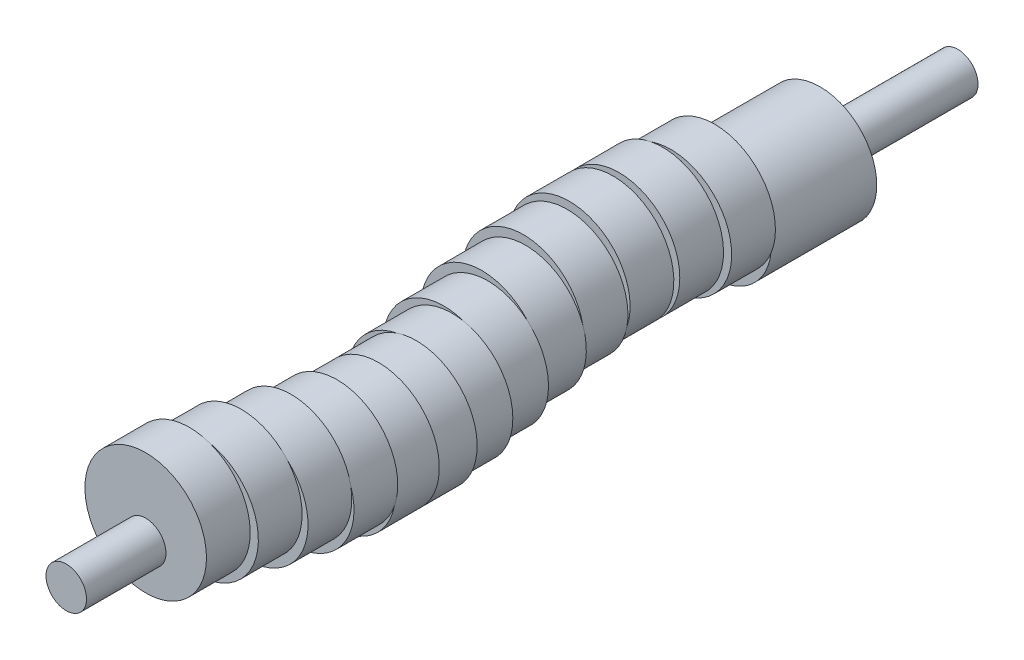
ISO-10303-21;
HEADER;
FILE_DESCRIPTION(('STEP AP214'),'2;1');
FILE_NAME('part.step','',(''),(''),'','','');
FILE_SCHEMA(('AUTOMOTIVE_DESIGN { 1 0 10303 214 1 1 1 1 }'));
ENDSEC;
DATA;
#1=APPLICATION_CONTEXT('core data for automotive mechanical design processes');
#2=APPLICATION_PROTOCOL_DEFINITION('international standard','automotive_design',2000,#1);
#3=PRODUCT_CONTEXT('',#1,'mechanical');
#4=PRODUCT('Part','Part','',(#3));
#5=PRODUCT_RELATED_PRODUCT_CATEGORY('part','',(#4));
#6=PRODUCT_DEFINITION_FORMATION('','',#4);
#7=PRODUCT_DEFINITION_CONTEXT('part definition',#1,'design');
#8=PRODUCT_DEFINITION('design','',#6,#7);
#9=PRODUCT_DEFINITION_SHAPE('','',#8);
#10=(LENGTH_UNIT() NAMED_UNIT(*) SI_UNIT(.MILLI.,.METRE.));
#11=(NAMED_UNIT(*) PLANE_ANGLE_UNIT() SI_UNIT($,.RADIAN.));
#12=(NAMED_UNIT(*) SI_UNIT($,.STERADIAN.) SOLID_ANGLE_UNIT());
#13=UNCERTAINTY_MEASURE_WITH_UNIT(LENGTH_MEASURE(1.E-05),#10,'distance_accuracy_value','');
#14=(GEOMETRIC_REPRESENTATION_CONTEXT(3) GLOBAL_UNCERTAINTY_ASSIGNED_CONTEXT((#13)) GLOBAL_UNIT_ASSIGNED_CONTEXT((#10,
#11,#12)) REPRESENTATION_CONTEXT('',''));
#15=CARTESIAN_POINT('',(0.,0.,0.));
#16=DIRECTION('',(0.,0.,1.));
#17=DIRECTION('',(1.,0.,0.));
#18=AXIS2_PLACEMENT_3D('',#15,#16,#17);
#19=CARTESIAN_POINT('',(0.,2.,5.4));
#20=DIRECTION('',(0.,0.,1.));
#21=DIRECTION('',(1.,0.,0.));
#22=AXIS2_PLACEMENT_3D('',#19,#20,#21);
#23=PLANE('',#22);
#24=CARTESIAN_POINT('',(0.,2.,5.4));
#25=DIRECTION('',(0.,0.,1.));
#26=DIRECTION('',(1.,0.,0.));
#27=AXIS2_PLACEMENT_3D('',#24,#25,#26);
#28=CIRCLE('',#27,7.5);
#29=CARTESIAN_POINT('',(7.5,2.,5.4));
#30=VERTEX_POINT('',#29);
#31=EDGE_CURVE('E278',#30,#30,#28,.T.);
#32=ORIENTED_EDGE('',*,*,#31,.T.);
#33=EDGE_LOOP('',(#32));
#34=FACE_BOUND('',#33,.T.);
#35=CARTESIAN_POINT('',(0.,0.,5.4));
#36=DIRECTION('',(0.,0.,1.));
#37=DIRECTION('',(1.,0.,0.));
#38=AXIS2_PLACEMENT_3D('',#35,#36,#37);
#39=CIRCLE('',#38,2.5);
#40=CARTESIAN_POINT('',(2.5,0.,5.4));
#41=VERTEX_POINT('',#40);
#42=EDGE_CURVE('E268',#41,#41,#39,.T.);
#43=ORIENTED_EDGE('',*,*,#42,.F.);
#44=EDGE_LOOP('',(#43));
#45=FACE_BOUND('',#44,.T.);
#46=ADVANCED_FACE('F39',(#34,#45),#23,.T.);
#47=CARTESIAN_POINT('',(0.,2.,0.));
#48=DIRECTION('',(0.,0.,1.));
#49=DIRECTION('',(1.,0.,0.));
#50=AXIS2_PLACEMENT_3D('',#47,#48,#49);
#51=PLANE('',#50);
#52=CARTESIAN_POINT('',(1.,1.73205080756888,0.));
#53=DIRECTION('',(0.,0.,-1.));
#54=DIRECTION('',(-1.,0.,0.));
#55=AXIS2_PLACEMENT_3D('',#52,#53,#54);
#56=CIRCLE('',#55,7.5);
#57=CARTESIAN_POINT('',(-1.43651396228676,-5.36114309303624,0.));
#58=VERTEX_POINT('',#57);
#59=CARTESIAN_POINT('',(2.43651396228676,9.09319390060512,0.));
#60=VERTEX_POINT('',#59);
#61=EDGE_CURVE('E273',#58,#60,#56,.T.);
#62=ORIENTED_EDGE('',*,*,#61,.F.);
#63=CARTESIAN_POINT('',(0.,2.,0.));
#64=DIRECTION('',(0.,0.,1.));
#65=DIRECTION('',(1.,0.,0.));
#66=AXIS2_PLACEMENT_3D('',#63,#64,#65);
#67=CIRCLE('',#66,7.5);
#68=EDGE_CURVE('E281',#60,#58,#67,.T.);
#69=ORIENTED_EDGE('',*,*,#68,.F.);
#70=EDGE_LOOP('',(#62,#69));
#71=FACE_BOUND('',#70,.T.);
#72=ADVANCED_FACE('F309',(#71),#51,.F.);
#73=CARTESIAN_POINT('',(0.,2.,5.4));
#74=DIRECTION('',(0.,0.,-1.));
#75=DIRECTION('',(-1.,0.,0.));
#76=AXIS2_PLACEMENT_3D('',#73,#74,#75);
#77=CYLINDRICAL_SURFACE('',#76,7.5);
#78=ORIENTED_EDGE('',*,*,#31,.F.);
#79=EDGE_LOOP('',(#78));
#80=FACE_BOUND('',#79,.T.);
#81=ORIENTED_EDGE('',*,*,#68,.T.);
#82=EDGE_CURVE('E277',#58,#60,#67,.T.);
#83=ORIENTED_EDGE('',*,*,#82,.T.);
#84=EDGE_LOOP('',(#81,#83));
#85=FACE_BOUND('',#84,.T.);
#86=ADVANCED_FACE('F41',(#80,#85),#77,.T.);
#87=CARTESIAN_POINT('',(1.,1.73205080756888,-5.4));
#88=DIRECTION('',(0.,0.,-1.));
#89=DIRECTION('',(-1.,0.,0.));
#90=AXIS2_PLACEMENT_3D('',#87,#88,#89);
#91=PLANE('',#90);
#92=CARTESIAN_POINT('',(1.73205080756888,0.999999999999996,-5.4));
#93=DIRECTION('',(0.,0.,-1.));
#94=DIRECTION('',(-1.,0.,0.));
#95=AXIS2_PLACEMENT_3D('',#92,#93,#94);
#96=CIRCLE('',#95,7.5);
#97=CARTESIAN_POINT('',(-3.9246291307495,-3.92462913074948,-5.4));
#98=VERTEX_POINT('',#97);
#99=CARTESIAN_POINT('',(6.65667993831838,6.65667993831836,-5.4));
#100=VERTEX_POINT('',#99);
#101=EDGE_CURVE('E263',#98,#100,#96,.T.);
#102=ORIENTED_EDGE('',*,*,#101,.F.);
#103=CARTESIAN_POINT('',(1.,1.73205080756888,-5.4));
#104=DIRECTION('',(0.,0.,-1.));
#105=DIRECTION('',(-1.,0.,0.));
#106=AXIS2_PLACEMENT_3D('',#103,#104,#105);
#107=CIRCLE('',#106,7.5);
#108=EDGE_CURVE('E269',#98,#100,#107,.T.);
#109=ORIENTED_EDGE('',*,*,#108,.T.);
#110=EDGE_LOOP('',(#102,#109));
#111=FACE_BOUND('',#110,.T.);
#112=ADVANCED_FACE('F297',(#111),#91,.T.);
#113=CARTESIAN_POINT('',(1.,1.73205080756888,0.));
#114=DIRECTION('',(0.,0.,-1.));
#115=DIRECTION('',(-1.,0.,0.));
#116=AXIS2_PLACEMENT_3D('',#113,#114,#115);
#117=PLANE('',#116);
#118=ORIENTED_EDGE('',*,*,#82,.F.);
#119=EDGE_CURVE('E258',#60,#58,#56,.T.);
#120=ORIENTED_EDGE('',*,*,#119,.F.);
#121=EDGE_LOOP('',(#118,#120));
#122=FACE_BOUND('',#121,.T.);
#123=ADVANCED_FACE('F295',(#122),#117,.F.);
#124=CARTESIAN_POINT('',(1.,1.73205080756888,-5.4));
#125=DIRECTION('',(0.,0.,1.));
#126=DIRECTION('',(1.,0.,0.));
#127=AXIS2_PLACEMENT_3D('',#124,#125,#126);
#128=CYLINDRICAL_SURFACE('',#127,7.5);
#129=EDGE_CURVE('E264',#100,#98,#107,.T.);
#130=ORIENTED_EDGE('',*,*,#129,.F.);
#131=ORIENTED_EDGE('',*,*,#108,.F.);
#132=EDGE_LOOP('',(#130,#131));
#133=FACE_BOUND('',#132,.T.);
#134=ORIENTED_EDGE('',*,*,#119,.T.);
#135=ORIENTED_EDGE('',*,*,#61,.T.);
#136=EDGE_LOOP('',(#134,#135));
#137=FACE_BOUND('',#136,.T.);
#138=ADVANCED_FACE('F292',(#133,#137),#128,.T.);
#139=CARTESIAN_POINT('',(1.73205080756888,0.999999999999996,-5.4));
#140=DIRECTION('',(0.,0.,-1.));
#141=DIRECTION('',(-1.,0.,0.));
#142=AXIS2_PLACEMENT_3D('',#139,#140,#141);
#143=PLANE('',#142);
#144=EDGE_CURVE('E248',#100,#98,#96,.T.);
#145=ORIENTED_EDGE('',*,*,#144,.F.);
#146=ORIENTED_EDGE('',*,*,#129,.T.);
#147=EDGE_LOOP('',(#145,#146));
#148=FACE_BOUND('',#147,.T.);
#149=ADVANCED_FACE('F303',(#148),#143,.F.);
#150=CARTESIAN_POINT('',(1.73205080756888,0.999999999999996,-10.8));
#151=DIRECTION('',(0.,0.,-1.));
#152=DIRECTION('',(-1.,0.,0.));
#153=AXIS2_PLACEMENT_3D('',#150,#151,#152);
#154=PLANE('',#153);
#155=CARTESIAN_POINT('',(2.,0.,-10.8));
#156=DIRECTION('',(0.,0.,-1.));
#157=DIRECTION('',(-1.,0.,0.));
#158=AXIS2_PLACEMENT_3D('',#155,#156,#157);
#159=CIRCLE('',#158,7.5);
#160=CARTESIAN_POINT('',(-5.36114309303625,-1.43651396228673,-10.8));
#161=VERTEX_POINT('',#160);
#162=CARTESIAN_POINT('',(9.09319390060513,2.43651396228672,-10.8));
#163=VERTEX_POINT('',#162);
#164=EDGE_CURVE('E253',#161,#163,#159,.T.);
#165=ORIENTED_EDGE('',*,*,#164,.F.);
#166=CARTESIAN_POINT('',(1.73205080756888,0.999999999999996,-10.8));
#167=DIRECTION('',(0.,0.,-1.));
#168=DIRECTION('',(-1.,0.,0.));
#169=AXIS2_PLACEMENT_3D('',#166,#167,#168);
#170=CIRCLE('',#169,7.5);
#171=EDGE_CURVE('E259',#161,#163,#170,.T.);
#172=ORIENTED_EDGE('',*,*,#171,.T.);
#173=EDGE_LOOP('',(#165,#172));
#174=FACE_BOUND('',#173,.T.);
#175=ADVANCED_FACE('F454',(#174),#154,.T.);
#176=CARTESIAN_POINT('',(1.73205080756888,0.999999999999996,-10.8));
#177=DIRECTION('',(0.,0.,1.));
#178=DIRECTION('',(1.,0.,0.));
#179=AXIS2_PLACEMENT_3D('',#176,#177,#178);
#180=CYLINDRICAL_SURFACE('',#179,7.5);
#181=EDGE_CURVE('E254',#163,#161,#170,.T.);
#182=ORIENTED_EDGE('',*,*,#181,.F.);
#183=ORIENTED_EDGE('',*,*,#171,.F.);
#184=EDGE_LOOP('',(#182,#183));
#185=FACE_BOUND('',#184,.T.);
#186=ORIENTED_EDGE('',*,*,#144,.T.);
#187=ORIENTED_EDGE('',*,*,#101,.T.);
#188=EDGE_LOOP('',(#186,#187));
#189=FACE_BOUND('',#188,.T.);
#190=ADVANCED_FACE('F449',(#185,#189),#180,.T.);
#191=CARTESIAN_POINT('',(2.,0.,-10.8));
#192=DIRECTION('',(0.,0.,-1.));
#193=DIRECTION('',(-1.,0.,0.));
#194=AXIS2_PLACEMENT_3D('',#191,#192,#193);
#195=PLANE('',#194);
#196=EDGE_CURVE('E239',#163,#161,#159,.T.);
#197=ORIENTED_EDGE('',*,*,#196,.F.);
#198=ORIENTED_EDGE('',*,*,#181,.T.);
#199=EDGE_LOOP('',(#197,#198));
#200=FACE_BOUND('',#199,.T.);
#201=ADVANCED_FACE('F445',(#200),#195,.F.);
#202=CARTESIAN_POINT('',(2.,0.,-16.2));
#203=DIRECTION('',(0.,0.,-1.));
#204=DIRECTION('',(-1.,0.,0.));
#205=AXIS2_PLACEMENT_3D('',#202,#203,#204);
#206=PLANE('',#205);
#207=CARTESIAN_POINT('',(1.73205080756888,-1.,-16.2));
#208=DIRECTION('',(0.,0.,-1.));
#209=DIRECTION('',(-1.,0.,0.));
#210=AXIS2_PLACEMENT_3D('',#207,#208,#209);
#211=CIRCLE('',#210,7.5);
#212=CARTESIAN_POINT('',(-5.36114309303624,1.43651396228677,-16.2));
#213=VERTEX_POINT('',#212);
#214=CARTESIAN_POINT('',(9.09319390060512,-2.43651396228678,-16.2));
#215=VERTEX_POINT('',#214);
#216=EDGE_CURVE('E241',#213,#215,#211,.T.);
#217=ORIENTED_EDGE('',*,*,#216,.F.);
#218=CARTESIAN_POINT('',(2.,0.,-16.2));
#219=DIRECTION('',(0.,0.,-1.));
#220=DIRECTION('',(-1.,0.,0.));
#221=AXIS2_PLACEMENT_3D('',#218,#219,#220);
#222=CIRCLE('',#221,7.5);
#223=EDGE_CURVE('E245',#213,#215,#222,.T.);
#224=ORIENTED_EDGE('',*,*,#223,.T.);
#225=EDGE_LOOP('',(#217,#224));
#226=FACE_BOUND('',#225,.T.);
#227=ADVANCED_FACE('F442',(#226),#206,.T.);
#228=CARTESIAN_POINT('',(2.,0.,-16.2));
#229=DIRECTION('',(0.,0.,1.));
#230=DIRECTION('',(1.,0.,0.));
#231=AXIS2_PLACEMENT_3D('',#228,#229,#230);
#232=CYLINDRICAL_SURFACE('',#231,7.5);
#233=ORIENTED_EDGE('',*,*,#223,.F.);
#234=EDGE_CURVE('E249',#215,#213,#222,.T.);
#235=ORIENTED_EDGE('',*,*,#234,.F.);
#236=EDGE_LOOP('',(#233,#235));
#237=FACE_BOUND('',#236,.T.);
#238=ORIENTED_EDGE('',*,*,#196,.T.);
#239=ORIENTED_EDGE('',*,*,#164,.T.);
#240=EDGE_LOOP('',(#238,#239));
#241=FACE_BOUND('',#240,.T.);
#242=ADVANCED_FACE('F437',(#237,#241),#232,.T.);
#243=CARTESIAN_POINT('',(1.73205080756888,-1.,-16.2));
#244=DIRECTION('',(0.,0.,-1.));
#245=DIRECTION('',(-1.,0.,0.));
#246=AXIS2_PLACEMENT_3D('',#243,#244,#245);
#247=PLANE('',#246);
#248=EDGE_CURVE('E230',#215,#213,#211,.T.);
#249=ORIENTED_EDGE('',*,*,#248,.F.);
#250=ORIENTED_EDGE('',*,*,#234,.T.);
#251=EDGE_LOOP('',(#249,#250));
#252=FACE_BOUND('',#251,.T.);
#253=ADVANCED_FACE('F433',(#252),#247,.F.);
#254=CARTESIAN_POINT('',(1.73205080756888,-1.,-21.6));
#255=DIRECTION('',(0.,0.,-1.));
#256=DIRECTION('',(-1.,0.,0.));
#257=AXIS2_PLACEMENT_3D('',#254,#255,#256);
#258=PLANE('',#257);
#259=CARTESIAN_POINT('',(0.999999999999995,-1.73205080756888,-21.6));
#260=DIRECTION('',(0.,0.,-1.));
#261=DIRECTION('',(-1.,0.,0.));
#262=AXIS2_PLACEMENT_3D('',#259,#260,#261);
#263=CIRCLE('',#262,7.5);
#264=CARTESIAN_POINT('',(-3.92462913074948,3.9246291307495,-21.6));
#265=VERTEX_POINT('',#264);
#266=CARTESIAN_POINT('',(6.65667993831836,-6.65667993831838,-21.6));
#267=VERTEX_POINT('',#266);
#268=EDGE_CURVE('E232',#265,#267,#263,.T.);
#269=ORIENTED_EDGE('',*,*,#268,.F.);
#270=CARTESIAN_POINT('',(1.73205080756888,-1.,-21.6));
#271=DIRECTION('',(0.,0.,-1.));
#272=DIRECTION('',(-1.,0.,0.));
#273=AXIS2_PLACEMENT_3D('',#270,#271,#272);
#274=CIRCLE('',#273,7.5);
#275=EDGE_CURVE('E236',#265,#267,#274,.T.);
#276=ORIENTED_EDGE('',*,*,#275,.T.);
#277=EDGE_LOOP('',(#269,#276));
#278=FACE_BOUND('',#277,.T.);
#279=ADVANCED_FACE('F430',(#278),#258,.T.);
#280=CARTESIAN_POINT('',(1.73205080756888,-1.,-21.6));
#281=DIRECTION('',(0.,0.,1.));
#282=DIRECTION('',(1.,0.,0.));
#283=AXIS2_PLACEMENT_3D('',#280,#281,#282);
#284=CYLINDRICAL_SURFACE('',#283,7.5);
#285=ORIENTED_EDGE('',*,*,#275,.F.);
#286=EDGE_CURVE('E240',#267,#265,#274,.T.);
#287=ORIENTED_EDGE('',*,*,#286,.F.);
#288=EDGE_LOOP('',(#285,#287));
#289=FACE_BOUND('',#288,.T.);
#290=ORIENTED_EDGE('',*,*,#216,.T.);
#291=ORIENTED_EDGE('',*,*,#248,.T.);
#292=EDGE_LOOP('',(#290,#291));
#293=FACE_BOUND('',#292,.T.);
#294=ADVANCED_FACE('F425',(#289,#293),#284,.T.);
#295=CARTESIAN_POINT('',(0.999999999999995,-1.73205080756888,-21.6));
#296=DIRECTION('',(0.,0.,-1.));
#297=DIRECTION('',(-1.,0.,0.));
#298=AXIS2_PLACEMENT_3D('',#295,#296,#297);
#299=PLANE('',#298);
#300=EDGE_CURVE('E221',#267,#265,#263,.T.);
#301=ORIENTED_EDGE('',*,*,#300,.F.);
#302=ORIENTED_EDGE('',*,*,#286,.T.);
#303=EDGE_LOOP('',(#301,#302));
#304=FACE_BOUND('',#303,.T.);
#305=ADVANCED_FACE('F421',(#304),#299,.F.);
#306=CARTESIAN_POINT('',(0.999999999999995,-1.73205080756888,-27.));
#307=DIRECTION('',(0.,0.,-1.));
#308=DIRECTION('',(-1.,0.,0.));
#309=AXIS2_PLACEMENT_3D('',#306,#307,#308);
#310=PLANE('',#309);
#311=CARTESIAN_POINT('',(0.,-2.,-27.));
#312=DIRECTION('',(0.,0.,-1.));
#313=DIRECTION('',(-1.,0.,0.));
#314=AXIS2_PLACEMENT_3D('',#311,#312,#313);
#315=CIRCLE('',#314,7.5);
#316=CARTESIAN_POINT('',(-1.43651396228675,5.36114309303624,-27.));
#317=VERTEX_POINT('',#316);
#318=CARTESIAN_POINT('',(2.43651396228673,-9.09319390060513,-27.));
#319=VERTEX_POINT('',#318);
#320=EDGE_CURVE('E223',#317,#319,#315,.T.);
#321=ORIENTED_EDGE('',*,*,#320,.F.);
#322=CARTESIAN_POINT('',(0.999999999999995,-1.73205080756888,-27.));
#323=DIRECTION('',(0.,0.,-1.));
#324=DIRECTION('',(-1.,0.,0.));
#325=AXIS2_PLACEMENT_3D('',#322,#323,#324);
#326=CIRCLE('',#325,7.5);
#327=EDGE_CURVE('E227',#317,#319,#326,.T.);
#328=ORIENTED_EDGE('',*,*,#327,.T.);
#329=EDGE_LOOP('',(#321,#328));
#330=FACE_BOUND('',#329,.T.);
#331=ADVANCED_FACE('F418',(#330),#310,.T.);
#332=CARTESIAN_POINT('',(0.999999999999995,-1.73205080756888,-27.));
#333=DIRECTION('',(0.,0.,1.));
#334=DIRECTION('',(1.,0.,0.));
#335=AXIS2_PLACEMENT_3D('',#332,#333,#334);
#336=CYLINDRICAL_SURFACE('',#335,7.5);
#337=ORIENTED_EDGE('',*,*,#327,.F.);
#338=EDGE_CURVE('E231',#319,#317,#326,.T.);
#339=ORIENTED_EDGE('',*,*,#338,.F.);
#340=EDGE_LOOP('',(#337,#339));
#341=FACE_BOUND('',#340,.T.);
#342=ORIENTED_EDGE('',*,*,#268,.T.);
#343=ORIENTED_EDGE('',*,*,#300,.T.);
#344=EDGE_LOOP('',(#342,#343));
#345=FACE_BOUND('',#344,.T.);
#346=ADVANCED_FACE('F413',(#341,#345),#336,.T.);
#347=CARTESIAN_POINT('',(0.,-2.,-27.));
#348=DIRECTION('',(0.,0.,-1.));
#349=DIRECTION('',(-1.,0.,0.));
#350=AXIS2_PLACEMENT_3D('',#347,#348,#349);
#351=PLANE('',#350);
#352=EDGE_CURVE('E212',#319,#317,#315,.T.);
#353=ORIENTED_EDGE('',*,*,#352,.F.);
#354=ORIENTED_EDGE('',*,*,#338,.T.);
#355=EDGE_LOOP('',(#353,#354));
#356=FACE_BOUND('',#355,.T.);
#357=ADVANCED_FACE('F409',(#356),#351,.F.);
#358=CARTESIAN_POINT('',(0.,-2.,-32.4));
#359=DIRECTION('',(0.,0.,-1.));
#360=DIRECTION('',(-1.,0.,0.));
#361=AXIS2_PLACEMENT_3D('',#358,#359,#360);
#362=PLANE('',#361);
#363=CARTESIAN_POINT('',(-0.99999999999999,-1.73205080756888,-32.4));
#364=DIRECTION('',(0.,0.,-1.));
#365=DIRECTION('',(-1.,0.,0.));
#366=AXIS2_PLACEMENT_3D('',#363,#364,#365);
#367=CIRCLE('',#366,7.5);
#368=CARTESIAN_POINT('',(1.43651396228675,5.36114309303624,-32.4));
#369=VERTEX_POINT('',#368);
#370=CARTESIAN_POINT('',(-2.43651396228672,-9.09319390060513,-32.4));
#371=VERTEX_POINT('',#370);
#372=EDGE_CURVE('E214',#369,#371,#367,.T.);
#373=ORIENTED_EDGE('',*,*,#372,.F.);
#374=CARTESIAN_POINT('',(0.,-2.,-32.4));
#375=DIRECTION('',(0.,0.,-1.));
#376=DIRECTION('',(-1.,0.,0.));
#377=AXIS2_PLACEMENT_3D('',#374,#375,#376);
#378=CIRCLE('',#377,7.5);
#379=EDGE_CURVE('E218',#369,#371,#378,.T.);
#380=ORIENTED_EDGE('',*,*,#379,.T.);
#381=EDGE_LOOP('',(#373,#380));
#382=FACE_BOUND('',#381,.T.);
#383=ADVANCED_FACE('F406',(#382),#362,.T.);
#384=CARTESIAN_POINT('',(0.,-2.,-32.4));
#385=DIRECTION('',(0.,0.,1.));
#386=DIRECTION('',(1.,0.,0.));
#387=AXIS2_PLACEMENT_3D('',#384,#385,#386);
#388=CYLINDRICAL_SURFACE('',#387,7.5);
#389=ORIENTED_EDGE('',*,*,#379,.F.);
#390=EDGE_CURVE('E222',#371,#369,#378,.T.);
#391=ORIENTED_EDGE('',*,*,#390,.F.);
#392=EDGE_LOOP('',(#389,#391));
#393=FACE_BOUND('',#392,.T.);
#394=ORIENTED_EDGE('',*,*,#320,.T.);
#395=ORIENTED_EDGE('',*,*,#352,.T.);
#396=EDGE_LOOP('',(#394,#395));
#397=FACE_BOUND('',#396,.T.);
#398=ADVANCED_FACE('F401',(#393,#397),#388,.T.);
#399=CARTESIAN_POINT('',(-0.99999999999999,-1.73205080756888,-32.4));
#400=DIRECTION('',(0.,0.,-1.));
#401=DIRECTION('',(-1.,0.,0.));
#402=AXIS2_PLACEMENT_3D('',#399,#400,#401);
#403=PLANE('',#402);
#404=EDGE_CURVE('E203',#371,#369,#367,.T.);
#405=ORIENTED_EDGE('',*,*,#404,.F.);
#406=ORIENTED_EDGE('',*,*,#390,.T.);
#407=EDGE_LOOP('',(#405,#406));
#408=FACE_BOUND('',#407,.T.);
#409=ADVANCED_FACE('F397',(#408),#403,.F.);
#410=CARTESIAN_POINT('',(-0.99999999999999,-1.73205080756888,-37.8));
#411=DIRECTION('',(0.,0.,-1.));
#412=DIRECTION('',(-1.,0.,0.));
#413=AXIS2_PLACEMENT_3D('',#410,#411,#412);
#414=PLANE('',#413);
#415=CARTESIAN_POINT('',(-1.73205080756887,-1.00000000000001,-37.8));
#416=DIRECTION('',(0.,0.,-1.));
#417=DIRECTION('',(-1.,0.,0.));
#418=AXIS2_PLACEMENT_3D('',#415,#416,#417);
#419=CIRCLE('',#418,7.5);
#420=CARTESIAN_POINT('',(3.92462913074947,3.92462913074952,-37.8));
#421=VERTEX_POINT('',#420);
#422=CARTESIAN_POINT('',(-6.65667993831833,-6.65667993831841,-37.8));
#423=VERTEX_POINT('',#422);
#424=EDGE_CURVE('E205',#421,#423,#419,.T.);
#425=ORIENTED_EDGE('',*,*,#424,.F.);
#426=CARTESIAN_POINT('',(-0.99999999999999,-1.73205080756888,-37.8));
#427=DIRECTION('',(0.,0.,-1.));
#428=DIRECTION('',(-1.,0.,0.));
#429=AXIS2_PLACEMENT_3D('',#426,#427,#428);
#430=CIRCLE('',#429,7.5);
#431=EDGE_CURVE('E209',#421,#423,#430,.T.);
#432=ORIENTED_EDGE('',*,*,#431,.T.);
#433=EDGE_LOOP('',(#425,#432));
#434=FACE_BOUND('',#433,.T.);
#435=ADVANCED_FACE('F394',(#434),#414,.T.);
#436=CARTESIAN_POINT('',(-0.99999999999999,-1.73205080756888,-37.8));
#437=DIRECTION('',(0.,0.,1.));
#438=DIRECTION('',(1.,0.,0.));
#439=AXIS2_PLACEMENT_3D('',#436,#437,#438);
#440=CYLINDRICAL_SURFACE('',#439,7.5);
#441=ORIENTED_EDGE('',*,*,#431,.F.);
#442=EDGE_CURVE('E213',#423,#421,#430,.T.);
#443=ORIENTED_EDGE('',*,*,#442,.F.);
#444=EDGE_LOOP('',(#441,#443));
#445=FACE_BOUND('',#444,.T.);
#446=ORIENTED_EDGE('',*,*,#372,.T.);
#447=ORIENTED_EDGE('',*,*,#404,.T.);
#448=EDGE_LOOP('',(#446,#447));
#449=FACE_BOUND('',#448,.T.);
#450=ADVANCED_FACE('F389',(#445,#449),#440,.T.);
#451=CARTESIAN_POINT('',(-1.73205080756887,-1.00000000000001,-37.8));
#452=DIRECTION('',(0.,0.,-1.));
#453=DIRECTION('',(-1.,0.,0.));
#454=AXIS2_PLACEMENT_3D('',#451,#452,#453);
#455=PLANE('',#454);
#456=EDGE_CURVE('E194',#423,#421,#419,.T.);
#457=ORIENTED_EDGE('',*,*,#456,.F.);
#458=ORIENTED_EDGE('',*,*,#442,.T.);
#459=EDGE_LOOP('',(#457,#458));
#460=FACE_BOUND('',#459,.T.);
#461=ADVANCED_FACE('F385',(#460),#455,.F.);
#462=CARTESIAN_POINT('',(-1.73205080756887,-1.00000000000001,-43.2));
#463=DIRECTION('',(0.,0.,-1.));
#464=DIRECTION('',(-1.,0.,0.));
#465=AXIS2_PLACEMENT_3D('',#462,#463,#464);
#466=PLANE('',#465);
#467=CARTESIAN_POINT('',(-2.,0.,-43.2));
#468=DIRECTION('',(0.,0.,-1.));
#469=DIRECTION('',(-1.,0.,0.));
#470=AXIS2_PLACEMENT_3D('',#467,#468,#469);
#471=CIRCLE('',#470,7.5);
#472=CARTESIAN_POINT('',(5.36114309303624,1.43651396228677,-43.2));
#473=VERTEX_POINT('',#472);
#474=CARTESIAN_POINT('',(-9.09319390060512,-2.43651396228677,-43.2));
#475=VERTEX_POINT('',#474);
#476=EDGE_CURVE('E196',#473,#475,#471,.T.);
#477=ORIENTED_EDGE('',*,*,#476,.F.);
#478=CARTESIAN_POINT('',(-1.73205080756887,-1.00000000000001,-43.2));
#479=DIRECTION('',(0.,0.,-1.));
#480=DIRECTION('',(-1.,0.,0.));
#481=AXIS2_PLACEMENT_3D('',#478,#479,#480);
#482=CIRCLE('',#481,7.5);
#483=EDGE_CURVE('E200',#473,#475,#482,.T.);
#484=ORIENTED_EDGE('',*,*,#483,.T.);
#485=EDGE_LOOP('',(#477,#484));
#486=FACE_BOUND('',#485,.T.);
#487=ADVANCED_FACE('F382',(#486),#466,.T.);
#488=CARTESIAN_POINT('',(-1.73205080756887,-1.00000000000001,-43.2));
#489=DIRECTION('',(0.,0.,1.));
#490=DIRECTION('',(1.,0.,0.));
#491=AXIS2_PLACEMENT_3D('',#488,#489,#490);
#492=CYLINDRICAL_SURFACE('',#491,7.5);
#493=ORIENTED_EDGE('',*,*,#483,.F.);
#494=EDGE_CURVE('E204',#475,#473,#482,.T.);
#495=ORIENTED_EDGE('',*,*,#494,.F.);
#496=EDGE_LOOP('',(#493,#495));
#497=FACE_BOUND('',#496,.T.);
#498=ORIENTED_EDGE('',*,*,#424,.T.);
#499=ORIENTED_EDGE('',*,*,#456,.T.);
#500=EDGE_LOOP('',(#498,#499));
#501=FACE_BOUND('',#500,.T.);
#502=ADVANCED_FACE('F377',(#497,#501),#492,.T.);
#503=CARTESIAN_POINT('',(-2.,0.,-43.2));
#504=DIRECTION('',(0.,0.,-1.));
#505=DIRECTION('',(-1.,0.,0.));
#506=AXIS2_PLACEMENT_3D('',#503,#504,#505);
#507=PLANE('',#506);
#508=EDGE_CURVE('E184',#475,#473,#471,.T.);
#509=ORIENTED_EDGE('',*,*,#508,.F.);
#510=ORIENTED_EDGE('',*,*,#494,.T.);
#511=EDGE_LOOP('',(#509,#510));
#512=FACE_BOUND('',#511,.T.);
#513=ADVANCED_FACE('F373',(#512),#507,.F.);
#514=CARTESIAN_POINT('',(-2.,0.,-48.6));
#515=DIRECTION('',(0.,0.,-1.));
#516=DIRECTION('',(-1.,0.,0.));
#517=AXIS2_PLACEMENT_3D('',#514,#515,#516);
#518=PLANE('',#517);
#519=CARTESIAN_POINT('',(-1.73205080756888,0.99999999999999,-48.6));
#520=DIRECTION('',(0.,0.,-1.));
#521=DIRECTION('',(-1.,0.,0.));
#522=AXIS2_PLACEMENT_3D('',#519,#520,#521);
#523=CIRCLE('',#522,7.5);
#524=CARTESIAN_POINT('',(5.36114309303625,-1.43651396228673,-48.6));
#525=VERTEX_POINT('',#524);
#526=CARTESIAN_POINT('',(-9.09319390060513,2.43651396228674,-48.6));
#527=VERTEX_POINT('',#526);
#528=EDGE_CURVE('E189',#525,#527,#523,.T.);
#529=ORIENTED_EDGE('',*,*,#528,.F.);
#530=CARTESIAN_POINT('',(-2.,0.,-48.6));
#531=DIRECTION('',(0.,0.,-1.));
#532=DIRECTION('',(-1.,0.,0.));
#533=AXIS2_PLACEMENT_3D('',#530,#531,#532);
#534=CIRCLE('',#533,7.5);
#535=EDGE_CURVE('E195',#525,#527,#534,.T.);
#536=ORIENTED_EDGE('',*,*,#535,.T.);
#537=EDGE_LOOP('',(#529,#536));
#538=FACE_BOUND('',#537,.T.);
#539=ADVANCED_FACE('F370',(#538),#518,.T.);
#540=CARTESIAN_POINT('',(-2.,0.,-48.6));
#541=DIRECTION('',(0.,0.,1.));
#542=DIRECTION('',(1.,0.,0.));
#543=AXIS2_PLACEMENT_3D('',#540,#541,#542);
#544=CYLINDRICAL_SURFACE('',#543,7.5);
#545=EDGE_CURVE('E190',#527,#525,#534,.T.);
#546=ORIENTED_EDGE('',*,*,#545,.F.);
#547=ORIENTED_EDGE('',*,*,#535,.F.);
#548=EDGE_LOOP('',(#546,#547));
#549=FACE_BOUND('',#548,.T.);
#550=ORIENTED_EDGE('',*,*,#476,.T.);
#551=ORIENTED_EDGE('',*,*,#508,.T.);
#552=EDGE_LOOP('',(#550,#551));
#553=FACE_BOUND('',#552,.T.);
#554=ADVANCED_FACE('F365',(#549,#553),#544,.T.);
#555=CARTESIAN_POINT('',(-1.73205080756888,0.99999999999999,-48.6));
#556=DIRECTION('',(0.,0.,-1.));
#557=DIRECTION('',(-1.,0.,0.));
#558=AXIS2_PLACEMENT_3D('',#555,#556,#557);
#559=PLANE('',#558);
#560=EDGE_CURVE('E175',#527,#525,#523,.T.);
#561=ORIENTED_EDGE('',*,*,#560,.F.);
#562=ORIENTED_EDGE('',*,*,#545,.T.);
#563=EDGE_LOOP('',(#561,#562));
#564=FACE_BOUND('',#563,.T.);
#565=ADVANCED_FACE('F361',(#564),#559,.F.);
#566=CARTESIAN_POINT('',(-1.73205080756888,0.99999999999999,-54.));
#567=DIRECTION('',(0.,0.,-1.));
#568=DIRECTION('',(-1.,0.,0.));
#569=AXIS2_PLACEMENT_3D('',#566,#567,#568);
#570=PLANE('',#569);
#571=CARTESIAN_POINT('',(-1.00000000000001,1.73205080756887,-54.));
#572=DIRECTION('',(0.,0.,-1.));
#573=DIRECTION('',(-1.,0.,0.));
#574=AXIS2_PLACEMENT_3D('',#571,#572,#573);
#575=CIRCLE('',#574,7.5);
#576=CARTESIAN_POINT('',(3.92462913074951,-3.92462913074948,-54.));
#577=VERTEX_POINT('',#576);
#578=CARTESIAN_POINT('',(-6.65667993831841,6.65667993831833,-54.));
#579=VERTEX_POINT('',#578);
#580=EDGE_CURVE('E49',#577,#579,#575,.T.);
#581=ORIENTED_EDGE('',*,*,#580,.F.);
#582=CARTESIAN_POINT('',(-1.73205080756888,0.99999999999999,-54.));
#583=DIRECTION('',(0.,0.,-1.));
#584=DIRECTION('',(-1.,0.,0.));
#585=AXIS2_PLACEMENT_3D('',#582,#583,#584);
#586=CIRCLE('',#585,7.5);
#587=EDGE_CURVE('E185',#577,#579,#586,.T.);
#588=ORIENTED_EDGE('',*,*,#587,.T.);
#589=EDGE_LOOP('',(#581,#588));
#590=FACE_BOUND('',#589,.T.);
#591=ADVANCED_FACE('F358',(#590),#570,.T.);
#592=CARTESIAN_POINT('',(-1.73205080756888,0.99999999999999,-54.));
#593=DIRECTION('',(0.,0.,1.));
#594=DIRECTION('',(1.,0.,0.));
#595=AXIS2_PLACEMENT_3D('',#592,#593,#594);
#596=CYLINDRICAL_SURFACE('',#595,7.5);
#597=EDGE_CURVE('E180',#579,#577,#586,.T.);
#598=ORIENTED_EDGE('',*,*,#597,.F.);
#599=ORIENTED_EDGE('',*,*,#587,.F.);
#600=EDGE_LOOP('',(#598,#599));
#601=FACE_BOUND('',#600,.T.);
#602=ORIENTED_EDGE('',*,*,#560,.T.);
#603=ORIENTED_EDGE('',*,*,#528,.T.);
#604=EDGE_LOOP('',(#602,#603));
#605=FACE_BOUND('',#604,.T.);
#606=ADVANCED_FACE('F353',(#601,#605),#596,.T.);
#607=CARTESIAN_POINT('',(-1.00000000000001,1.73205080756887,-54.));
#608=DIRECTION('',(0.,0.,-1.));
#609=DIRECTION('',(-1.,0.,0.));
#610=AXIS2_PLACEMENT_3D('',#607,#608,#609);
#611=PLANE('',#610);
#612=EDGE_CURVE('E153',#579,#577,#575,.T.);
#613=ORIENTED_EDGE('',*,*,#612,.F.);
#614=ORIENTED_EDGE('',*,*,#597,.T.);
#615=EDGE_LOOP('',(#613,#614));
#616=FACE_BOUND('',#615,.T.);
#617=ADVANCED_FACE('F350',(#616),#611,.F.);
#618=CARTESIAN_POINT('',(-1.00000000000001,1.73205080756887,-59.4));
#619=DIRECTION('',(0.,0.,-1.));
#620=DIRECTION('',(-1.,0.,0.));
#621=AXIS2_PLACEMENT_3D('',#618,#619,#620);
#622=PLANE('',#621);
#623=CARTESIAN_POINT('',(0.,2.,-59.4));
#624=DIRECTION('',(0.,0.,-1.));
#625=DIRECTION('',(-1.,0.,0.));
#626=AXIS2_PLACEMENT_3D('',#623,#624,#625);
#627=CIRCLE('',#626,7.5);
#628=CARTESIAN_POINT('',(1.43651396228677,-5.36114309303624,-59.4));
#629=VERTEX_POINT('',#628);
#630=CARTESIAN_POINT('',(-2.43651396228677,9.09319390060511,-59.4));
#631=VERTEX_POINT('',#630);
#632=EDGE_CURVE('E11',#629,#631,#627,.T.);
#633=ORIENTED_EDGE('',*,*,#632,.F.);
#634=CARTESIAN_POINT('',(-1.00000000000001,1.73205080756887,-59.4));
#635=DIRECTION('',(0.,0.,-1.));
#636=DIRECTION('',(-1.,0.,0.));
#637=AXIS2_PLACEMENT_3D('',#634,#635,#636);
#638=CIRCLE('',#637,7.5);
#639=EDGE_CURVE('E176',#629,#631,#638,.T.);
#640=ORIENTED_EDGE('',*,*,#639,.T.);
#641=EDGE_LOOP('',(#633,#640));
#642=FACE_BOUND('',#641,.T.);
#643=ADVANCED_FACE('F347',(#642),#622,.T.);
#644=CARTESIAN_POINT('',(-1.00000000000001,1.73205080756887,-59.4));
#645=DIRECTION('',(0.,0.,1.));
#646=DIRECTION('',(1.,0.,0.));
#647=AXIS2_PLACEMENT_3D('',#644,#645,#646);
#648=CYLINDRICAL_SURFACE('',#647,7.5);
#649=EDGE_CURVE('E171',#631,#629,#638,.T.);
#650=ORIENTED_EDGE('',*,*,#649,.F.);
#651=ORIENTED_EDGE('',*,*,#639,.F.);
#652=EDGE_LOOP('',(#650,#651));
#653=FACE_BOUND('',#652,.T.);
#654=ORIENTED_EDGE('',*,*,#612,.T.);
#655=ORIENTED_EDGE('',*,*,#580,.T.);
#656=EDGE_LOOP('',(#654,#655));
#657=FACE_BOUND('',#656,.T.);
#658=ADVANCED_FACE('F343',(#653,#657),#648,.T.);
#659=CARTESIAN_POINT('',(0.,2.,-59.4));
#660=DIRECTION('',(0.,0.,-1.));
#661=DIRECTION('',(-1.,0.,0.));
#662=AXIS2_PLACEMENT_3D('',#659,#660,#661);
#663=PLANE('',#662);
#664=EDGE_CURVE('E51',#631,#629,#627,.T.);
#665=ORIENTED_EDGE('',*,*,#664,.F.);
#666=ORIENTED_EDGE('',*,*,#649,.T.);
#667=EDGE_LOOP('',(#665,#666));
#668=FACE_BOUND('',#667,.T.);
#669=ADVANCED_FACE('F340',(#668),#663,.F.);
#670=CARTESIAN_POINT('',(0.,2.,-64.8));
#671=DIRECTION('',(0.,0.,-1.));
#672=DIRECTION('',(-1.,0.,0.));
#673=AXIS2_PLACEMENT_3D('',#670,#671,#672);
#674=PLANE('',#673);
#675=CARTESIAN_POINT('',(0.,2.,-64.8));
#676=DIRECTION('',(0.,0.,-1.));
#677=DIRECTION('',(-1.,0.,0.));
#678=AXIS2_PLACEMENT_3D('',#675,#676,#677);
#679=CIRCLE('',#678,7.5);
#680=CARTESIAN_POINT('',(-6.95268608165219,-0.812499999999998,-64.8));
#681=VERTEX_POINT('',#680);
#682=CARTESIAN_POINT('',(6.95268608165218,-0.812499999999998,-64.8));
#683=VERTEX_POINT('',#682);
#684=EDGE_CURVE('E57',#681,#683,#679,.T.);
#685=ORIENTED_EDGE('',*,*,#684,.T.);
#686=CARTESIAN_POINT('',(0.,0.,-64.8));
#687=DIRECTION('',(0.,0.,-1.));
#688=DIRECTION('',(-1.,0.,0.));
#689=AXIS2_PLACEMENT_3D('',#686,#687,#688);
#690=CIRCLE('',#689,7.);
#691=EDGE_CURVE('E142',#681,#683,#690,.T.);
#692=ORIENTED_EDGE('',*,*,#691,.F.);
#693=EDGE_LOOP('',(#685,#692));
#694=FACE_BOUND('',#693,.T.);
#695=ADVANCED_FACE('F143',(#694),#674,.T.);
#696=CARTESIAN_POINT('',(0.,2.,-64.8));
#697=DIRECTION('',(0.,0.,1.));
#698=DIRECTION('',(1.,0.,0.));
#699=AXIS2_PLACEMENT_3D('',#696,#697,#698);
#700=CYLINDRICAL_SURFACE('',#699,7.5);
#701=EDGE_CURVE('E138',#683,#681,#679,.T.);
#702=ORIENTED_EDGE('',*,*,#701,.F.);
#703=ORIENTED_EDGE('',*,*,#684,.F.);
#704=EDGE_LOOP('',(#702,#703));
#705=FACE_BOUND('',#704,.T.);
#706=ORIENTED_EDGE('',*,*,#664,.T.);
#707=ORIENTED_EDGE('',*,*,#632,.T.);
#708=EDGE_LOOP('',(#706,#707));
#709=FACE_BOUND('',#708,.T.);
#710=ADVANCED_FACE('F135',(#705,#709),#700,.T.);
#711=CARTESIAN_POINT('',(0.,0.,15.2));
#712=DIRECTION('',(0.,0.,-1.));
#713=DIRECTION('',(-1.,0.,0.));
#714=AXIS2_PLACEMENT_3D('',#711,#712,#713);
#715=CYLINDRICAL_SURFACE('',#714,2.5);
#716=ORIENTED_EDGE('',*,*,#42,.T.);
#717=EDGE_LOOP('',(#716));
#718=FACE_BOUND('',#717,.T.);
#719=CARTESIAN_POINT('',(0.,0.,15.2));
#720=DIRECTION('',(0.,0.,-1.));
#721=DIRECTION('',(-1.,0.,0.));
#722=AXIS2_PLACEMENT_3D('',#719,#720,#721);
#723=CIRCLE('',#722,2.5);
#724=CARTESIAN_POINT('',(-2.5,0.,15.2));
#725=VERTEX_POINT('',#724);
#726=EDGE_CURVE('E165',#725,#725,#723,.T.);
#727=ORIENTED_EDGE('',*,*,#726,.T.);
#728=EDGE_LOOP('',(#727));
#729=FACE_BOUND('',#728,.T.);
#730=ADVANCED_FACE('F319',(#718,#729),#715,.T.);
#731=CARTESIAN_POINT('',(0.,0.,15.2));
#732=DIRECTION('',(0.,0.,-1.));
#733=DIRECTION('',(-1.,0.,0.));
#734=AXIS2_PLACEMENT_3D('',#731,#732,#733);
#735=PLANE('',#734);
#736=ORIENTED_EDGE('',*,*,#726,.F.);
#737=EDGE_LOOP('',(#736));
#738=FACE_BOUND('',#737,.T.);
#739=ADVANCED_FACE('F322',(#738),#735,.F.);
#740=CARTESIAN_POINT('',(0.,0.,-77.8));
#741=DIRECTION('',(0.,0.,1.));
#742=DIRECTION('',(1.,0.,0.));
#743=AXIS2_PLACEMENT_3D('',#740,#741,#742);
#744=CYLINDRICAL_SURFACE('',#743,7.);
#745=CARTESIAN_POINT('',(0.,0.,-77.8));
#746=DIRECTION('',(0.,0.,-1.));
#747=DIRECTION('',(-1.,0.,0.));
#748=AXIS2_PLACEMENT_3D('',#745,#746,#747);
#749=CIRCLE('',#748,7.);
#750=CARTESIAN_POINT('',(-7.,0.,-77.8));
#751=VERTEX_POINT('',#750);
#752=EDGE_CURVE('E156',#751,#751,#749,.T.);
#753=ORIENTED_EDGE('',*,*,#752,.F.);
#754=EDGE_LOOP('',(#753));
#755=FACE_BOUND('',#754,.T.);
#756=EDGE_CURVE('E148',#683,#681,#690,.T.);
#757=ORIENTED_EDGE('',*,*,#756,.T.);
#758=ORIENTED_EDGE('',*,*,#691,.T.);
#759=EDGE_LOOP('',(#757,#758));
#760=FACE_BOUND('',#759,.T.);
#761=ADVANCED_FACE('F154',(#755,#760),#744,.T.);
#762=CARTESIAN_POINT('',(0.,0.,-77.8));
#763=DIRECTION('',(0.,0.,-1.));
#764=DIRECTION('',(-1.,0.,0.));
#765=AXIS2_PLACEMENT_3D('',#762,#763,#764);
#766=PLANE('',#765);
#767=CARTESIAN_POINT('',(0.,0.,-77.8));
#768=DIRECTION('',(0.,0.,-1.));
#769=DIRECTION('',(-1.,0.,0.));
#770=AXIS2_PLACEMENT_3D('',#767,#768,#769);
#771=CIRCLE('',#770,2.5);
#772=CARTESIAN_POINT('',(-2.5,0.,-77.8));
#773=VERTEX_POINT('',#772);
#774=EDGE_CURVE('E43',#773,#773,#771,.T.);
#775=ORIENTED_EDGE('',*,*,#774,.F.);
#776=EDGE_LOOP('',(#775));
#777=FACE_BOUND('',#776,.T.);
#778=ORIENTED_EDGE('',*,*,#752,.T.);
#779=EDGE_LOOP('',(#778));
#780=FACE_BOUND('',#779,.T.);
#781=ADVANCED_FACE('F331',(#777,#780),#766,.T.);
#782=CARTESIAN_POINT('',(0.,0.,-64.8));
#783=DIRECTION('',(0.,0.,-1.));
#784=DIRECTION('',(-1.,0.,0.));
#785=AXIS2_PLACEMENT_3D('',#782,#783,#784);
#786=PLANE('',#785);
#787=ORIENTED_EDGE('',*,*,#756,.F.);
#788=ORIENTED_EDGE('',*,*,#701,.T.);
#789=EDGE_LOOP('',(#787,#788));
#790=FACE_BOUND('',#789,.T.);
#791=ADVANCED_FACE('F151',(#790),#786,.F.);
#792=CARTESIAN_POINT('',(0.,0.,-94.8));
#793=DIRECTION('',(0.,0.,-1.));
#794=DIRECTION('',(-1.,0.,0.));
#795=AXIS2_PLACEMENT_3D('',#792,#793,#794);
#796=PLANE('',#795);
#797=CARTESIAN_POINT('',(0.,0.,-94.8));
#798=DIRECTION('',(0.,0.,-1.));
#799=DIRECTION('',(-1.,0.,0.));
#800=AXIS2_PLACEMENT_3D('',#797,#798,#799);
#801=CIRCLE('',#800,2.5);
#802=CARTESIAN_POINT('',(-2.5,0.,-94.8));
#803=VERTEX_POINT('',#802);
#804=EDGE_CURVE('E161',#803,#803,#801,.T.);
#805=ORIENTED_EDGE('',*,*,#804,.T.);
#806=EDGE_LOOP('',(#805));
#807=FACE_BOUND('',#806,.T.);
#808=ADVANCED_FACE('F516',(#807),#796,.T.);
#809=CARTESIAN_POINT('',(0.,0.,-94.8));
#810=DIRECTION('',(0.,0.,1.));
#811=DIRECTION('',(1.,0.,0.));
#812=AXIS2_PLACEMENT_3D('',#809,#810,#811);
#813=CYLINDRICAL_SURFACE('',#812,2.5);
#814=ORIENTED_EDGE('',*,*,#774,.T.);
#815=EDGE_LOOP('',(#814));
#816=FACE_BOUND('',#815,.T.);
#817=ORIENTED_EDGE('',*,*,#804,.F.);
#818=EDGE_LOOP('',(#817));
#819=FACE_BOUND('',#818,.T.);
#820=ADVANCED_FACE('F335',(#816,#819),#813,.T.);
#821=CLOSED_SHELL('',(#46,#72,#86,#112,#123,#138,#149,#175,#190,#201,#227,#242,#253,#279,#294,
#305,#331,#346,#357,#383,#398,#409,#435,#450,#461,#487,#502,#513,#539,#554,#565,#591,#606,#617,
#643,#658,#669,#695,#710,#730,#739,#761,#781,#791,#808,#820));
#822=MANIFOLD_SOLID_BREP('B2',#821);
#823=ADVANCED_BREP_SHAPE_REPRESENTATION('',(#18,#822),#14);
#824=SHAPE_DEFINITION_REPRESENTATION(#9,#823);
ENDSEC;
END-ISO-10303-21;
